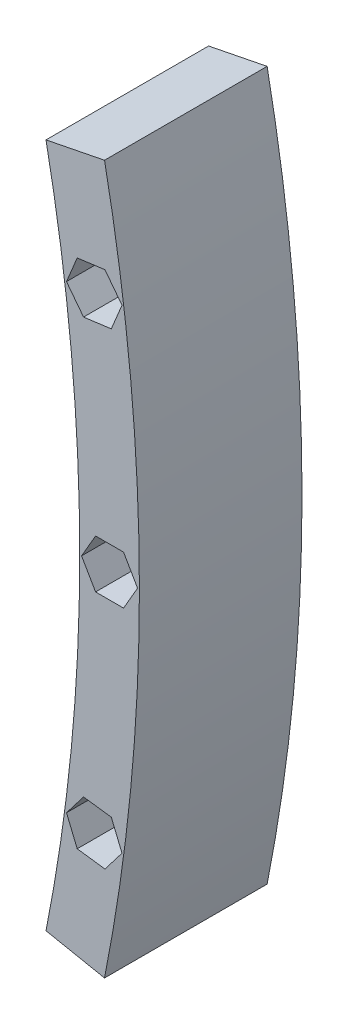
ISO-10303-21;
HEADER;
FILE_DESCRIPTION(('STEP AP214'),'2;1');
FILE_NAME('part.step','',(''),(''),'','','');
FILE_SCHEMA(('AUTOMOTIVE_DESIGN { 1 0 10303 214 1 1 1 1 }'));
ENDSEC;
DATA;
#1=APPLICATION_CONTEXT('core data for automotive mechanical design processes');
#2=APPLICATION_PROTOCOL_DEFINITION('international standard','automotive_design',2000,#1);
#3=PRODUCT_CONTEXT('',#1,'mechanical');
#4=PRODUCT('Part','Part','',(#3));
#5=PRODUCT_RELATED_PRODUCT_CATEGORY('part','',(#4));
#6=PRODUCT_DEFINITION_FORMATION('','',#4);
#7=PRODUCT_DEFINITION_CONTEXT('part definition',#1,'design');
#8=PRODUCT_DEFINITION('design','',#6,#7);
#9=PRODUCT_DEFINITION_SHAPE('','',#8);
#10=(LENGTH_UNIT() NAMED_UNIT(*) SI_UNIT(.MILLI.,.METRE.));
#11=(NAMED_UNIT(*) PLANE_ANGLE_UNIT() SI_UNIT($,.RADIAN.));
#12=(NAMED_UNIT(*) SI_UNIT($,.STERADIAN.) SOLID_ANGLE_UNIT());
#13=UNCERTAINTY_MEASURE_WITH_UNIT(LENGTH_MEASURE(1.E-05),#10,'distance_accuracy_value','');
#14=(GEOMETRIC_REPRESENTATION_CONTEXT(3) GLOBAL_UNCERTAINTY_ASSIGNED_CONTEXT((#13)) GLOBAL_UNIT_ASSIGNED_CONTEXT((#10,
#11,#12)) REPRESENTATION_CONTEXT('',''));
#15=CARTESIAN_POINT('',(0.,0.,0.));
#16=DIRECTION('',(0.,0.,1.));
#17=DIRECTION('',(1.,0.,0.));
#18=AXIS2_PLACEMENT_3D('',#15,#16,#17);
#19=CARTESIAN_POINT('',(0.640728861933532,0.,21.8));
#20=DIRECTION('',(0.,0.,1.));
#21=DIRECTION('',(1.,0.,0.));
#22=AXIS2_PLACEMENT_3D('',#19,#20,#21);
#23=PLANE('',#22);
#24=CARTESIAN_POINT('',(0.640728861933532,0.,21.8));
#25=DIRECTION('',(0.,0.,1.));
#26=DIRECTION('',(1.,0.,0.));
#27=AXIS2_PLACEMENT_3D('',#24,#25,#26);
#28=CIRCLE('',#27,243.359271138079);
#29=CARTESIAN_POINT('',(239.32391984382,-47.4770385719381,21.8));
#30=VERTEX_POINT('',#29);
#31=CARTESIAN_POINT('',(239.32391984382,47.4770385719381,21.8));
#32=VERTEX_POINT('',#31);
#33=EDGE_CURVE('E323',#30,#32,#28,.T.);
#34=ORIENTED_EDGE('',*,*,#33,.T.);
#35=DIRECTION('',(-0.980785280403227,-0.195090322016146,0.));
#36=VECTOR('',#35,1.);
#37=CARTESIAN_POINT('',(239.32391984382,47.4770385719381,21.8));
#38=LINE('',#37,#36);
#39=CARTESIAN_POINT('',(231.477637600594,45.916315995809,21.8));
#40=VERTEX_POINT('',#39);
#41=EDGE_CURVE('E326',#32,#40,#38,.T.);
#42=ORIENTED_EDGE('',*,*,#41,.T.);
#43=CARTESIAN_POINT('',(0.640728861933532,0.,21.8));
#44=DIRECTION('',(0.,0.,-1.));
#45=DIRECTION('',(1.,0.,0.));
#46=AXIS2_PLACEMENT_3D('',#43,#44,#45);
#47=CIRCLE('',#46,235.359271138079);
#48=CARTESIAN_POINT('',(231.477637600594,-45.9163159958091,21.8));
#49=VERTEX_POINT('',#48);
#50=EDGE_CURVE('E329',#40,#49,#47,.T.);
#51=ORIENTED_EDGE('',*,*,#50,.T.);
#52=DIRECTION('',(0.980785280403231,-0.195090322016124,0.));
#53=VECTOR('',#52,1.);
#54=CARTESIAN_POINT('',(239.32391984382,-47.4770385719381,21.8));
#55=LINE('',#54,#53);
#56=EDGE_CURVE('E331',#49,#30,#55,.T.);
#57=ORIENTED_EDGE('',*,*,#56,.T.);
#58=EDGE_LOOP('',(#34,#42,#51,#57));
#59=FACE_BOUND('',#58,.T.);
#60=DIRECTION('',(0.382683432361066,0.923879532512954,0.));
#61=VECTOR('',#60,1.);
#62=CARTESIAN_POINT('',(241.667437954132,31.8161217922106,21.8));
#63=LINE('',#62,#61);
#64=CARTESIAN_POINT('',(240.23131246666,28.3490081630422,21.8));
#65=VERTEX_POINT('',#64);
#66=CARTESIAN_POINT('',(241.667437954132,31.8161217922106,21.8));
#67=VERTEX_POINT('',#66);
#68=EDGE_CURVE('E280',#65,#67,#63,.T.);
#69=ORIENTED_EDGE('',*,*,#68,.F.);
#70=DIRECTION('',(0.991444861373241,0.130526192224373,0.));
#71=VECTOR('',#70,1.);
#72=CARTESIAN_POINT('',(240.23131246666,28.3490081630422,21.8));
#73=LINE('',#72,#71);
#74=CARTESIAN_POINT('',(236.510641242256,27.8591725036314,21.8));
#75=VERTEX_POINT('',#74);
#76=EDGE_CURVE('E278',#75,#65,#73,.T.);
#77=ORIENTED_EDGE('',*,*,#76,.F.);
#78=DIRECTION('',(0.608761429012178,-0.793353340288582,0.));
#79=VECTOR('',#78,1.);
#80=CARTESIAN_POINT('',(236.510641242256,27.8591725036314,21.8));
#81=LINE('',#80,#79);
#82=CARTESIAN_POINT('',(234.226095505325,30.8364504733891,21.8));
#83=VERTEX_POINT('',#82);
#84=EDGE_CURVE('E290',#83,#75,#81,.T.);
#85=ORIENTED_EDGE('',*,*,#84,.F.);
#86=DIRECTION('',(-0.382683432361066,-0.923879532512953,0.));
#87=VECTOR('',#86,1.);
#88=CARTESIAN_POINT('',(234.226095505325,30.8364504733891,21.8));
#89=LINE('',#88,#87);
#90=CARTESIAN_POINT('',(235.662220992798,34.3035641025575,21.8));
#91=VERTEX_POINT('',#90);
#92=EDGE_CURVE('E287',#91,#83,#89,.T.);
#93=ORIENTED_EDGE('',*,*,#92,.F.);
#94=DIRECTION('',(-0.991444861373241,-0.130526192224374,0.));
#95=VECTOR('',#94,1.);
#96=CARTESIAN_POINT('',(235.662220992798,34.3035641025575,21.8));
#97=LINE('',#96,#95);
#98=CARTESIAN_POINT('',(239.382892217201,34.7933997619682,21.8));
#99=VERTEX_POINT('',#98);
#100=EDGE_CURVE('E285',#99,#91,#97,.T.);
#101=ORIENTED_EDGE('',*,*,#100,.F.);
#102=DIRECTION('',(-0.608761429012181,0.79335334028858,0.));
#103=VECTOR('',#102,1.);
#104=CARTESIAN_POINT('',(239.382892217201,34.7933997619682,21.8));
#105=LINE('',#104,#103);
#106=EDGE_CURVE('E283',#67,#99,#105,.T.);
#107=ORIENTED_EDGE('',*,*,#106,.F.);
#108=EDGE_LOOP('',(#69,#77,#85,#93,#101,#107));
#109=FACE_BOUND('',#108,.T.);
#110=DIRECTION('',(0.500000000003788,0.866025403782252,0.));
#111=VECTOR('',#110,1.);
#112=CARTESIAN_POINT('',(241.876388374865,-3.25000000002081,21.8));
#113=LINE('',#112,#111);
#114=CARTESIAN_POINT('',(241.876388374865,-3.25000000002081,21.8));
#115=VERTEX_POINT('',#114);
#116=CARTESIAN_POINT('',(243.752776749745,-2.89693399477583E-11,21.8));
#117=VERTEX_POINT('',#116);
#118=EDGE_CURVE('E235',#115,#117,#113,.T.);
#119=ORIENTED_EDGE('',*,*,#118,.F.);
#120=DIRECTION('',(1.,-4.37104210635652E-12,0.));
#121=VECTOR('',#120,1.);
#122=CARTESIAN_POINT('',(238.123611625132,-3.2500000000044,21.8));
#123=LINE('',#122,#121);
#124=CARTESIAN_POINT('',(238.123611625132,-3.2500000000044,21.8));
#125=VERTEX_POINT('',#124);
#126=EDGE_CURVE('E233',#125,#115,#123,.T.);
#127=ORIENTED_EDGE('',*,*,#126,.F.);
#128=DIRECTION('',(0.499999999996215,-0.866025403786624,0.));
#129=VECTOR('',#128,1.);
#130=CARTESIAN_POINT('',(236.24722325028,3.78337769112423E-12,21.8));
#131=LINE('',#130,#129);
#132=CARTESIAN_POINT('',(236.24722325028,3.78863607153335E-12,21.8));
#133=VERTEX_POINT('',#132);
#134=EDGE_CURVE('E245',#133,#125,#131,.T.);
#135=ORIENTED_EDGE('',*,*,#134,.F.);
#136=DIRECTION('',(-0.500000000003785,-0.866025403782254,0.));
#137=VECTOR('',#136,1.);
#138=CARTESIAN_POINT('',(238.123611625161,3.2499999999956,21.8));
#139=LINE('',#138,#137);
#140=CARTESIAN_POINT('',(238.123611625161,3.2499999999956,21.8));
#141=VERTEX_POINT('',#140);
#142=EDGE_CURVE('E242',#141,#133,#139,.T.);
#143=ORIENTED_EDGE('',*,*,#142,.F.);
#144=DIRECTION('',(-1.,4.37115766901793E-12,0.));
#145=VECTOR('',#144,1.);
#146=CARTESIAN_POINT('',(241.876388374893,3.24999999997919,21.8));
#147=LINE('',#146,#145);
#148=CARTESIAN_POINT('',(241.876388374893,3.24999999997919,21.8));
#149=VERTEX_POINT('',#148);
#150=EDGE_CURVE('E240',#149,#141,#147,.T.);
#151=ORIENTED_EDGE('',*,*,#150,.F.);
#152=DIRECTION('',(-0.499999999996218,0.866025403786622,0.));
#153=VECTOR('',#152,1.);
#154=CARTESIAN_POINT('',(243.752776749745,-2.89693399477583E-11,21.8));
#155=LINE('',#154,#153);
#156=EDGE_CURVE('E238',#117,#149,#155,.T.);
#157=ORIENTED_EDGE('',*,*,#156,.F.);
#158=EDGE_LOOP('',(#119,#127,#135,#143,#151,#157));
#159=FACE_BOUND('',#158,.T.);
#160=DIRECTION('',(0.991444861373241,-0.130526192224374,0.));
#161=VECTOR('',#160,1.);
#162=CARTESIAN_POINT('',(235.662220992798,-34.3035641025575,21.8));
#163=LINE('',#162,#161);
#164=CARTESIAN_POINT('',(235.662220992798,-34.3035641025575,21.8));
#165=VERTEX_POINT('',#164);
#166=CARTESIAN_POINT('',(239.382892217201,-34.7933997619682,21.8));
#167=VERTEX_POINT('',#166);
#168=EDGE_CURVE('E190',#165,#167,#163,.T.);
#169=ORIENTED_EDGE('',*,*,#168,.F.);
#170=DIRECTION('',(0.382683432361066,-0.923879532512953,0.));
#171=VECTOR('',#170,1.);
#172=CARTESIAN_POINT('',(234.226095505325,-30.8364504733891,21.8));
#173=LINE('',#172,#171);
#174=CARTESIAN_POINT('',(234.226095505325,-30.8364504733891,21.8));
#175=VERTEX_POINT('',#174);
#176=EDGE_CURVE('E182',#175,#165,#173,.T.);
#177=ORIENTED_EDGE('',*,*,#176,.F.);
#178=DIRECTION('',(-0.608761429012178,-0.793353340288582,0.));
#179=VECTOR('',#178,1.);
#180=CARTESIAN_POINT('',(236.510641242256,-27.8591725036314,21.8));
#181=LINE('',#180,#179);
#182=CARTESIAN_POINT('',(236.510641242256,-27.8591725036314,21.8));
#183=VERTEX_POINT('',#182);
#184=EDGE_CURVE('E211',#183,#175,#181,.T.);
#185=ORIENTED_EDGE('',*,*,#184,.F.);
#186=DIRECTION('',(-0.991444861373241,0.130526192224373,0.));
#187=VECTOR('',#186,1.);
#188=CARTESIAN_POINT('',(240.23131246666,-28.3490081630422,21.8));
#189=LINE('',#188,#187);
#190=CARTESIAN_POINT('',(240.23131246666,-28.3490081630422,21.8));
#191=VERTEX_POINT('',#190);
#192=EDGE_CURVE('E209',#191,#183,#189,.T.);
#193=ORIENTED_EDGE('',*,*,#192,.F.);
#194=DIRECTION('',(-0.382683432361066,0.923879532512954,0.));
#195=VECTOR('',#194,1.);
#196=CARTESIAN_POINT('',(241.667437954132,-31.8161217922106,21.8));
#197=LINE('',#196,#195);
#198=CARTESIAN_POINT('',(241.667437954132,-31.8161217922106,21.8));
#199=VERTEX_POINT('',#198);
#200=EDGE_CURVE('E205',#199,#191,#197,.T.);
#201=ORIENTED_EDGE('',*,*,#200,.F.);
#202=DIRECTION('',(0.608761429012181,0.79335334028858,0.));
#203=VECTOR('',#202,1.);
#204=CARTESIAN_POINT('',(239.382892217201,-34.7933997619682,21.8));
#205=LINE('',#204,#203);
#206=EDGE_CURVE('E203',#167,#199,#205,.T.);
#207=ORIENTED_EDGE('',*,*,#206,.F.);
#208=EDGE_LOOP('',(#169,#177,#185,#193,#201,#207));
#209=FACE_BOUND('',#208,.T.);
#210=ADVANCED_FACE('F33',(#59,#109,#159,#209),#23,.T.);
#211=CARTESIAN_POINT('',(0.640728861933532,0.,0.));
#212=DIRECTION('',(0.,0.,1.));
#213=DIRECTION('',(1.,0.,0.));
#214=AXIS2_PLACEMENT_3D('',#211,#212,#213);
#215=PLANE('',#214);
#216=DIRECTION('',(1.,-4.37104210635652E-12,0.));
#217=VECTOR('',#216,1.);
#218=CARTESIAN_POINT('',(238.123611625132,-3.2500000000044,0.));
#219=LINE('',#218,#217);
#220=CARTESIAN_POINT('',(238.123611625132,-3.2500000000044,0.));
#221=VERTEX_POINT('',#220);
#222=CARTESIAN_POINT('',(241.876388374865,-3.25000000002081,0.));
#223=VERTEX_POINT('',#222);
#224=EDGE_CURVE('E198',#221,#223,#219,.T.);
#225=ORIENTED_EDGE('',*,*,#224,.T.);
#226=DIRECTION('',(0.500000000003788,0.866025403782252,0.));
#227=VECTOR('',#226,1.);
#228=CARTESIAN_POINT('',(241.876388374865,-3.25000000002081,0.));
#229=LINE('',#228,#227);
#230=CARTESIAN_POINT('',(243.752776749745,-2.89693399477583E-11,0.));
#231=VERTEX_POINT('',#230);
#232=EDGE_CURVE('E250',#223,#231,#229,.T.);
#233=ORIENTED_EDGE('',*,*,#232,.T.);
#234=DIRECTION('',(-0.499999999996218,0.866025403786622,0.));
#235=VECTOR('',#234,1.);
#236=CARTESIAN_POINT('',(243.752776749745,-2.89693399477583E-11,0.));
#237=LINE('',#236,#235);
#238=CARTESIAN_POINT('',(241.876388374893,3.24999999997919,0.));
#239=VERTEX_POINT('',#238);
#240=EDGE_CURVE('E253',#231,#239,#237,.T.);
#241=ORIENTED_EDGE('',*,*,#240,.T.);
#242=DIRECTION('',(-1.,4.37115766901793E-12,0.));
#243=VECTOR('',#242,1.);
#244=CARTESIAN_POINT('',(241.876388374893,3.24999999997919,0.));
#245=LINE('',#244,#243);
#246=CARTESIAN_POINT('',(238.123611625161,3.2499999999956,0.));
#247=VERTEX_POINT('',#246);
#248=EDGE_CURVE('E256',#239,#247,#245,.T.);
#249=ORIENTED_EDGE('',*,*,#248,.T.);
#250=DIRECTION('',(-0.500000000003785,-0.866025403782254,0.));
#251=VECTOR('',#250,1.);
#252=CARTESIAN_POINT('',(238.123611625161,3.2499999999956,0.));
#253=LINE('',#252,#251);
#254=CARTESIAN_POINT('',(236.24722325028,3.78337769112423E-12,0.));
#255=VERTEX_POINT('',#254);
#256=EDGE_CURVE('E259',#247,#255,#253,.T.);
#257=ORIENTED_EDGE('',*,*,#256,.T.);
#258=DIRECTION('',(0.499999999996215,-0.866025403786624,0.));
#259=VECTOR('',#258,1.);
#260=CARTESIAN_POINT('',(236.24722325028,3.78337769112423E-12,0.));
#261=LINE('',#260,#259);
#262=EDGE_CURVE('E236',#255,#221,#261,.T.);
#263=ORIENTED_EDGE('',*,*,#262,.T.);
#264=EDGE_LOOP('',(#225,#233,#241,#249,#257,#263));
#265=FACE_BOUND('',#264,.T.);
#266=CARTESIAN_POINT('',(0.640728861933532,0.,0.));
#267=DIRECTION('',(0.,0.,1.));
#268=DIRECTION('',(1.,0.,0.));
#269=AXIS2_PLACEMENT_3D('',#266,#267,#268);
#270=CIRCLE('',#269,243.359271138079);
#271=CARTESIAN_POINT('',(239.32391984382,-47.4770385719381,0.));
#272=VERTEX_POINT('',#271);
#273=CARTESIAN_POINT('',(239.32391984382,47.4770385719381,0.));
#274=VERTEX_POINT('',#273);
#275=EDGE_CURVE('E322',#272,#274,#270,.T.);
#276=ORIENTED_EDGE('',*,*,#275,.F.);
#277=DIRECTION('',(0.980785280403231,-0.195090322016124,0.));
#278=VECTOR('',#277,1.);
#279=CARTESIAN_POINT('',(239.32391984382,-47.4770385719381,0.));
#280=LINE('',#279,#278);
#281=CARTESIAN_POINT('',(231.477637600594,-45.9163159958091,0.));
#282=VERTEX_POINT('',#281);
#283=EDGE_CURVE('E327',#282,#272,#280,.T.);
#284=ORIENTED_EDGE('',*,*,#283,.F.);
#285=CARTESIAN_POINT('',(0.640728861933532,0.,0.));
#286=DIRECTION('',(0.,0.,-1.));
#287=DIRECTION('',(1.,0.,0.));
#288=AXIS2_PLACEMENT_3D('',#285,#286,#287);
#289=CIRCLE('',#288,235.359271138079);
#290=CARTESIAN_POINT('',(231.477637600594,45.916315995809,0.));
#291=VERTEX_POINT('',#290);
#292=EDGE_CURVE('E338',#291,#282,#289,.T.);
#293=ORIENTED_EDGE('',*,*,#292,.F.);
#294=DIRECTION('',(-0.980785280403227,-0.195090322016146,0.));
#295=VECTOR('',#294,1.);
#296=CARTESIAN_POINT('',(239.32391984382,47.4770385719381,0.));
#297=LINE('',#296,#295);
#298=EDGE_CURVE('E336',#274,#291,#297,.T.);
#299=ORIENTED_EDGE('',*,*,#298,.F.);
#300=EDGE_LOOP('',(#276,#284,#293,#299));
#301=FACE_BOUND('',#300,.T.);
#302=DIRECTION('',(0.991444861373241,0.130526192224373,0.));
#303=VECTOR('',#302,1.);
#304=CARTESIAN_POINT('',(240.23131246666,28.3490081630422,0.));
#305=LINE('',#304,#303);
#306=CARTESIAN_POINT('',(236.510641242256,27.8591725036314,0.));
#307=VERTEX_POINT('',#306);
#308=CARTESIAN_POINT('',(240.23131246666,28.3490081630422,0.));
#309=VERTEX_POINT('',#308);
#310=EDGE_CURVE('E277',#307,#309,#305,.T.);
#311=ORIENTED_EDGE('',*,*,#310,.T.);
#312=DIRECTION('',(0.382683432361066,0.923879532512954,0.));
#313=VECTOR('',#312,1.);
#314=CARTESIAN_POINT('',(241.667437954132,31.8161217922106,0.));
#315=LINE('',#314,#313);
#316=CARTESIAN_POINT('',(241.667437954132,31.8161217922106,0.));
#317=VERTEX_POINT('',#316);
#318=EDGE_CURVE('E295',#309,#317,#315,.T.);
#319=ORIENTED_EDGE('',*,*,#318,.T.);
#320=DIRECTION('',(-0.608761429012181,0.79335334028858,0.));
#321=VECTOR('',#320,1.);
#322=CARTESIAN_POINT('',(239.382892217201,34.7933997619682,0.));
#323=LINE('',#322,#321);
#324=CARTESIAN_POINT('',(239.382892217201,34.7933997619682,0.));
#325=VERTEX_POINT('',#324);
#326=EDGE_CURVE('E298',#317,#325,#323,.T.);
#327=ORIENTED_EDGE('',*,*,#326,.T.);
#328=DIRECTION('',(-0.991444861373241,-0.130526192224374,0.));
#329=VECTOR('',#328,1.);
#330=CARTESIAN_POINT('',(235.662220992798,34.3035641025575,0.));
#331=LINE('',#330,#329);
#332=CARTESIAN_POINT('',(235.662220992798,34.3035641025575,0.));
#333=VERTEX_POINT('',#332);
#334=EDGE_CURVE('E301',#325,#333,#331,.T.);
#335=ORIENTED_EDGE('',*,*,#334,.T.);
#336=DIRECTION('',(-0.382683432361066,-0.923879532512953,0.));
#337=VECTOR('',#336,1.);
#338=CARTESIAN_POINT('',(234.226095505325,30.8364504733891,0.));
#339=LINE('',#338,#337);
#340=CARTESIAN_POINT('',(234.226095505325,30.8364504733891,0.));
#341=VERTEX_POINT('',#340);
#342=EDGE_CURVE('E304',#333,#341,#339,.T.);
#343=ORIENTED_EDGE('',*,*,#342,.T.);
#344=DIRECTION('',(0.608761429012178,-0.793353340288582,0.));
#345=VECTOR('',#344,1.);
#346=CARTESIAN_POINT('',(236.510641242256,27.8591725036314,0.));
#347=LINE('',#346,#345);
#348=EDGE_CURVE('E281',#341,#307,#347,.T.);
#349=ORIENTED_EDGE('',*,*,#348,.T.);
#350=EDGE_LOOP('',(#311,#319,#327,#335,#343,#349));
#351=FACE_BOUND('',#350,.T.);
#352=DIRECTION('',(0.382683432361066,-0.923879532512953,0.));
#353=VECTOR('',#352,1.);
#354=CARTESIAN_POINT('',(234.226095505325,-30.8364504733891,0.));
#355=LINE('',#354,#353);
#356=CARTESIAN_POINT('',(234.226095505325,-30.8364504733891,0.));
#357=VERTEX_POINT('',#356);
#358=CARTESIAN_POINT('',(235.662220992798,-34.3035641025575,0.));
#359=VERTEX_POINT('',#358);
#360=EDGE_CURVE('E56',#357,#359,#355,.T.);
#361=ORIENTED_EDGE('',*,*,#360,.T.);
#362=DIRECTION('',(0.991444861373241,-0.130526192224374,0.));
#363=VECTOR('',#362,1.);
#364=CARTESIAN_POINT('',(235.662220992798,-34.3035641025575,0.));
#365=LINE('',#364,#363);
#366=CARTESIAN_POINT('',(239.382892217201,-34.7933997619682,0.));
#367=VERTEX_POINT('',#366);
#368=EDGE_CURVE('E197',#359,#367,#365,.T.);
#369=ORIENTED_EDGE('',*,*,#368,.T.);
#370=DIRECTION('',(0.608761429012181,0.79335334028858,0.));
#371=VECTOR('',#370,1.);
#372=CARTESIAN_POINT('',(239.382892217201,-34.7933997619682,0.));
#373=LINE('',#372,#371);
#374=CARTESIAN_POINT('',(241.667437954132,-31.8161217922106,0.));
#375=VERTEX_POINT('',#374);
#376=EDGE_CURVE('E215',#367,#375,#373,.T.);
#377=ORIENTED_EDGE('',*,*,#376,.T.);
#378=DIRECTION('',(-0.382683432361066,0.923879532512954,0.));
#379=VECTOR('',#378,1.);
#380=CARTESIAN_POINT('',(241.667437954132,-31.8161217922106,0.));
#381=LINE('',#380,#379);
#382=CARTESIAN_POINT('',(240.23131246666,-28.3490081630422,0.));
#383=VERTEX_POINT('',#382);
#384=EDGE_CURVE('E218',#375,#383,#381,.T.);
#385=ORIENTED_EDGE('',*,*,#384,.T.);
#386=DIRECTION('',(-0.991444861373241,0.130526192224373,0.));
#387=VECTOR('',#386,1.);
#388=CARTESIAN_POINT('',(240.23131246666,-28.3490081630422,0.));
#389=LINE('',#388,#387);
#390=CARTESIAN_POINT('',(236.510641242256,-27.8591725036314,0.));
#391=VERTEX_POINT('',#390);
#392=EDGE_CURVE('E221',#383,#391,#389,.T.);
#393=ORIENTED_EDGE('',*,*,#392,.T.);
#394=DIRECTION('',(-0.608761429012178,-0.793353340288582,0.));
#395=VECTOR('',#394,1.);
#396=CARTESIAN_POINT('',(236.510641242256,-27.8591725036314,0.));
#397=LINE('',#396,#395);
#398=EDGE_CURVE('E191',#391,#357,#397,.T.);
#399=ORIENTED_EDGE('',*,*,#398,.T.);
#400=EDGE_LOOP('',(#361,#369,#377,#385,#393,#399));
#401=FACE_BOUND('',#400,.T.);
#402=ADVANCED_FACE('F356',(#265,#301,#351,#401),#215,.F.);
#403=CARTESIAN_POINT('',(0.640728861933532,0.,21.8));
#404=DIRECTION('',(0.,0.,-1.));
#405=DIRECTION('',(-1.,0.,0.));
#406=AXIS2_PLACEMENT_3D('',#403,#404,#405);
#407=CYLINDRICAL_SURFACE('',#406,243.359271138079);
#408=ORIENTED_EDGE('',*,*,#275,.T.);
#409=DIRECTION('',(0.,0.,-1.));
#410=VECTOR('',#409,1.);
#411=CARTESIAN_POINT('',(239.32391984382,47.4770385719381,21.8));
#412=LINE('',#411,#410);
#413=EDGE_CURVE('E11',#32,#274,#412,.T.);
#414=ORIENTED_EDGE('',*,*,#413,.F.);
#415=ORIENTED_EDGE('',*,*,#33,.F.);
#416=DIRECTION('',(0.,0.,-1.));
#417=VECTOR('',#416,1.);
#418=CARTESIAN_POINT('',(239.32391984382,-47.4770385719381,21.8));
#419=LINE('',#418,#417);
#420=EDGE_CURVE('E333',#30,#272,#419,.T.);
#421=ORIENTED_EDGE('',*,*,#420,.T.);
#422=EDGE_LOOP('',(#408,#414,#415,#421));
#423=FACE_BOUND('',#422,.T.);
#424=ADVANCED_FACE('F35',(#423),#407,.T.);
#425=CARTESIAN_POINT('',(239.32391984382,47.4770385719381,21.8));
#426=DIRECTION('',(0.195090322016146,-0.980785280403227,0.));
#427=DIRECTION('',(0.980785280403227,0.195090322016146,0.));
#428=AXIS2_PLACEMENT_3D('',#425,#426,#427);
#429=PLANE('',#428);
#430=ORIENTED_EDGE('',*,*,#298,.T.);
#431=DIRECTION('',(0.,0.,-1.));
#432=VECTOR('',#431,1.);
#433=CARTESIAN_POINT('',(231.477637600594,45.916315995809,21.8));
#434=LINE('',#433,#432);
#435=EDGE_CURVE('E41',#40,#291,#434,.T.);
#436=ORIENTED_EDGE('',*,*,#435,.F.);
#437=ORIENTED_EDGE('',*,*,#41,.F.);
#438=ORIENTED_EDGE('',*,*,#413,.T.);
#439=EDGE_LOOP('',(#430,#436,#437,#438));
#440=FACE_BOUND('',#439,.T.);
#441=ADVANCED_FACE('F367',(#440),#429,.F.);
#442=CARTESIAN_POINT('',(0.640728861933532,0.,21.8));
#443=DIRECTION('',(0.,0.,-1.));
#444=DIRECTION('',(-1.,0.,0.));
#445=AXIS2_PLACEMENT_3D('',#442,#443,#444);
#446=CYLINDRICAL_SURFACE('',#445,235.359271138079);
#447=ORIENTED_EDGE('',*,*,#292,.T.);
#448=DIRECTION('',(0.,0.,-1.));
#449=VECTOR('',#448,1.);
#450=CARTESIAN_POINT('',(231.477637600594,-45.9163159958091,21.8));
#451=LINE('',#450,#449);
#452=EDGE_CURVE('E343',#49,#282,#451,.T.);
#453=ORIENTED_EDGE('',*,*,#452,.F.);
#454=ORIENTED_EDGE('',*,*,#50,.F.);
#455=ORIENTED_EDGE('',*,*,#435,.T.);
#456=EDGE_LOOP('',(#447,#453,#454,#455));
#457=FACE_BOUND('',#456,.T.);
#458=ADVANCED_FACE('F350',(#457),#446,.F.);
#459=CARTESIAN_POINT('',(239.32391984382,-47.4770385719381,21.8));
#460=DIRECTION('',(0.195090322016124,0.980785280403231,0.));
#461=DIRECTION('',(-0.980785280403231,0.195090322016124,0.));
#462=AXIS2_PLACEMENT_3D('',#459,#460,#461);
#463=PLANE('',#462);
#464=ORIENTED_EDGE('',*,*,#283,.T.);
#465=ORIENTED_EDGE('',*,*,#420,.F.);
#466=ORIENTED_EDGE('',*,*,#56,.F.);
#467=ORIENTED_EDGE('',*,*,#452,.T.);
#468=EDGE_LOOP('',(#464,#465,#466,#467));
#469=FACE_BOUND('',#468,.T.);
#470=ADVANCED_FACE('F360',(#469),#463,.F.);
#471=CARTESIAN_POINT('',(240.23131246666,28.3490081630422,21.8));
#472=DIRECTION('',(-0.130526192224373,0.991444861373242,0.));
#473=DIRECTION('',(-0.991444861373242,-0.130526192224373,0.));
#474=AXIS2_PLACEMENT_3D('',#471,#472,#473);
#475=PLANE('',#474);
#476=ORIENTED_EDGE('',*,*,#310,.F.);
#477=DIRECTION('',(0.,0.,-1.));
#478=VECTOR('',#477,1.);
#479=CARTESIAN_POINT('',(236.510641242256,27.8591725036314,21.8));
#480=LINE('',#479,#478);
#481=EDGE_CURVE('E292',#75,#307,#480,.T.);
#482=ORIENTED_EDGE('',*,*,#481,.F.);
#483=ORIENTED_EDGE('',*,*,#76,.T.);
#484=DIRECTION('',(0.,0.,-1.));
#485=VECTOR('',#484,1.);
#486=CARTESIAN_POINT('',(240.23131246666,28.3490081630422,21.8));
#487=LINE('',#486,#485);
#488=EDGE_CURVE('E319',#65,#309,#487,.T.);
#489=ORIENTED_EDGE('',*,*,#488,.T.);
#490=EDGE_LOOP('',(#476,#482,#483,#489));
#491=FACE_BOUND('',#490,.T.);
#492=ADVANCED_FACE('F382',(#491),#475,.T.);
#493=CARTESIAN_POINT('',(241.667437954132,31.8161217922106,21.8));
#494=DIRECTION('',(-0.923879532512954,0.382683432361066,0.));
#495=DIRECTION('',(-0.382683432361066,-0.923879532512954,0.));
#496=AXIS2_PLACEMENT_3D('',#493,#494,#495);
#497=PLANE('',#496);
#498=ORIENTED_EDGE('',*,*,#318,.F.);
#499=ORIENTED_EDGE('',*,*,#488,.F.);
#500=ORIENTED_EDGE('',*,*,#68,.T.);
#501=DIRECTION('',(0.,0.,-1.));
#502=VECTOR('',#501,1.);
#503=CARTESIAN_POINT('',(241.667437954132,31.8161217922106,21.8));
#504=LINE('',#503,#502);
#505=EDGE_CURVE('E317',#67,#317,#504,.T.);
#506=ORIENTED_EDGE('',*,*,#505,.T.);
#507=EDGE_LOOP('',(#498,#499,#500,#506));
#508=FACE_BOUND('',#507,.T.);
#509=ADVANCED_FACE('F389',(#508),#497,.T.);
#510=CARTESIAN_POINT('',(239.382892217201,34.7933997619682,21.8));
#511=DIRECTION('',(-0.79335334028858,-0.608761429012181,0.));
#512=DIRECTION('',(0.608761429012181,-0.79335334028858,0.));
#513=AXIS2_PLACEMENT_3D('',#510,#511,#512);
#514=PLANE('',#513);
#515=ORIENTED_EDGE('',*,*,#326,.F.);
#516=ORIENTED_EDGE('',*,*,#505,.F.);
#517=ORIENTED_EDGE('',*,*,#106,.T.);
#518=DIRECTION('',(0.,0.,-1.));
#519=VECTOR('',#518,1.);
#520=CARTESIAN_POINT('',(239.382892217201,34.7933997619682,21.8));
#521=LINE('',#520,#519);
#522=EDGE_CURVE('E315',#99,#325,#521,.T.);
#523=ORIENTED_EDGE('',*,*,#522,.T.);
#524=EDGE_LOOP('',(#515,#516,#517,#523));
#525=FACE_BOUND('',#524,.T.);
#526=ADVANCED_FACE('F394',(#525),#514,.T.);
#527=CARTESIAN_POINT('',(235.662220992798,34.3035641025575,21.8));
#528=DIRECTION('',(0.130526192224374,-0.991444861373241,0.));
#529=DIRECTION('',(0.991444861373241,0.130526192224374,0.));
#530=AXIS2_PLACEMENT_3D('',#527,#528,#529);
#531=PLANE('',#530);
#532=ORIENTED_EDGE('',*,*,#334,.F.);
#533=ORIENTED_EDGE('',*,*,#522,.F.);
#534=ORIENTED_EDGE('',*,*,#100,.T.);
#535=DIRECTION('',(0.,0.,-1.));
#536=VECTOR('',#535,1.);
#537=CARTESIAN_POINT('',(235.662220992798,34.3035641025575,21.8));
#538=LINE('',#537,#536);
#539=EDGE_CURVE('E313',#91,#333,#538,.T.);
#540=ORIENTED_EDGE('',*,*,#539,.T.);
#541=EDGE_LOOP('',(#532,#533,#534,#540));
#542=FACE_BOUND('',#541,.T.);
#543=ADVANCED_FACE('F419',(#542),#531,.T.);
#544=CARTESIAN_POINT('',(234.226095505325,30.8364504733891,21.8));
#545=DIRECTION('',(0.923879532512953,-0.382683432361066,0.));
#546=DIRECTION('',(0.382683432361066,0.923879532512953,0.));
#547=AXIS2_PLACEMENT_3D('',#544,#545,#546);
#548=PLANE('',#547);
#549=ORIENTED_EDGE('',*,*,#342,.F.);
#550=ORIENTED_EDGE('',*,*,#539,.F.);
#551=ORIENTED_EDGE('',*,*,#92,.T.);
#552=DIRECTION('',(0.,0.,-1.));
#553=VECTOR('',#552,1.);
#554=CARTESIAN_POINT('',(234.226095505325,30.8364504733891,21.8));
#555=LINE('',#554,#553);
#556=EDGE_CURVE('E311',#83,#341,#555,.T.);
#557=ORIENTED_EDGE('',*,*,#556,.T.);
#558=EDGE_LOOP('',(#549,#550,#551,#557));
#559=FACE_BOUND('',#558,.T.);
#560=ADVANCED_FACE('F408',(#559),#548,.T.);
#561=CARTESIAN_POINT('',(236.510641242256,27.8591725036314,21.8));
#562=DIRECTION('',(0.793353340288582,0.608761429012178,0.));
#563=DIRECTION('',(-0.608761429012178,0.793353340288582,0.));
#564=AXIS2_PLACEMENT_3D('',#561,#562,#563);
#565=PLANE('',#564);
#566=ORIENTED_EDGE('',*,*,#348,.F.);
#567=ORIENTED_EDGE('',*,*,#556,.F.);
#568=ORIENTED_EDGE('',*,*,#84,.T.);
#569=ORIENTED_EDGE('',*,*,#481,.T.);
#570=EDGE_LOOP('',(#566,#567,#568,#569));
#571=FACE_BOUND('',#570,.T.);
#572=ADVANCED_FACE('F401',(#571),#565,.T.);
#573=CARTESIAN_POINT('',(238.123611625132,-3.2500000000044,21.8));
#574=DIRECTION('',(4.37104210635652E-12,1.,0.));
#575=DIRECTION('',(-1.,4.37104210635652E-12,0.));
#576=AXIS2_PLACEMENT_3D('',#573,#574,#575);
#577=PLANE('',#576);
#578=ORIENTED_EDGE('',*,*,#224,.F.);
#579=DIRECTION('',(0.,0.,-1.));
#580=VECTOR('',#579,1.);
#581=CARTESIAN_POINT('',(238.123611625132,-3.2500000000044,21.8));
#582=LINE('',#581,#580);
#583=EDGE_CURVE('E247',#125,#221,#582,.T.);
#584=ORIENTED_EDGE('',*,*,#583,.F.);
#585=ORIENTED_EDGE('',*,*,#126,.T.);
#586=DIRECTION('',(0.,0.,-1.));
#587=VECTOR('',#586,1.);
#588=CARTESIAN_POINT('',(241.876388374865,-3.25000000002081,21.8));
#589=LINE('',#588,#587);
#590=EDGE_CURVE('E274',#115,#223,#589,.T.);
#591=ORIENTED_EDGE('',*,*,#590,.T.);
#592=EDGE_LOOP('',(#578,#584,#585,#591));
#593=FACE_BOUND('',#592,.T.);
#594=ADVANCED_FACE('F431',(#593),#577,.T.);
#595=CARTESIAN_POINT('',(241.876388374865,-3.25000000002081,21.8));
#596=DIRECTION('',(-0.866025403782252,0.500000000003788,0.));
#597=DIRECTION('',(-0.500000000003788,-0.866025403782252,0.));
#598=AXIS2_PLACEMENT_3D('',#595,#596,#597);
#599=PLANE('',#598);
#600=ORIENTED_EDGE('',*,*,#232,.F.);
#601=ORIENTED_EDGE('',*,*,#590,.F.);
#602=ORIENTED_EDGE('',*,*,#118,.T.);
#603=DIRECTION('',(0.,0.,-1.));
#604=VECTOR('',#603,1.);
#605=CARTESIAN_POINT('',(243.752776749745,-2.89693399477583E-11,21.8));
#606=LINE('',#605,#604);
#607=EDGE_CURVE('E272',#117,#231,#606,.T.);
#608=ORIENTED_EDGE('',*,*,#607,.T.);
#609=EDGE_LOOP('',(#600,#601,#602,#608));
#610=FACE_BOUND('',#609,.T.);
#611=ADVANCED_FACE('F434',(#610),#599,.T.);
#612=CARTESIAN_POINT('',(243.752776749745,-2.89693399477583E-11,21.8));
#613=DIRECTION('',(-0.866025403786622,-0.499999999996218,0.));
#614=DIRECTION('',(0.499999999996218,-0.866025403786622,0.));
#615=AXIS2_PLACEMENT_3D('',#612,#613,#614);
#616=PLANE('',#615);
#617=ORIENTED_EDGE('',*,*,#240,.F.);
#618=ORIENTED_EDGE('',*,*,#607,.F.);
#619=ORIENTED_EDGE('',*,*,#156,.T.);
#620=DIRECTION('',(0.,0.,-1.));
#621=VECTOR('',#620,1.);
#622=CARTESIAN_POINT('',(241.876388374893,3.24999999997919,21.8));
#623=LINE('',#622,#621);
#624=EDGE_CURVE('E270',#149,#239,#623,.T.);
#625=ORIENTED_EDGE('',*,*,#624,.T.);
#626=EDGE_LOOP('',(#617,#618,#619,#625));
#627=FACE_BOUND('',#626,.T.);
#628=ADVANCED_FACE('F438',(#627),#616,.T.);
#629=CARTESIAN_POINT('',(241.876388374893,3.24999999997919,21.8));
#630=DIRECTION('',(-4.37115766901793E-12,-1.,0.));
#631=DIRECTION('',(1.,-4.37115766901793E-12,0.));
#632=AXIS2_PLACEMENT_3D('',#629,#630,#631);
#633=PLANE('',#632);
#634=ORIENTED_EDGE('',*,*,#248,.F.);
#635=ORIENTED_EDGE('',*,*,#624,.F.);
#636=ORIENTED_EDGE('',*,*,#150,.T.);
#637=DIRECTION('',(0.,0.,-1.));
#638=VECTOR('',#637,1.);
#639=CARTESIAN_POINT('',(238.123611625161,3.2499999999956,21.8));
#640=LINE('',#639,#638);
#641=EDGE_CURVE('E268',#141,#247,#640,.T.);
#642=ORIENTED_EDGE('',*,*,#641,.T.);
#643=EDGE_LOOP('',(#634,#635,#636,#642));
#644=FACE_BOUND('',#643,.T.);
#645=ADVANCED_FACE('F442',(#644),#633,.T.);
#646=CARTESIAN_POINT('',(238.123611625161,3.2499999999956,21.8));
#647=DIRECTION('',(0.866025403782254,-0.500000000003785,0.));
#648=DIRECTION('',(0.500000000003785,0.866025403782254,0.));
#649=AXIS2_PLACEMENT_3D('',#646,#647,#648);
#650=PLANE('',#649);
#651=ORIENTED_EDGE('',*,*,#256,.F.);
#652=ORIENTED_EDGE('',*,*,#641,.F.);
#653=ORIENTED_EDGE('',*,*,#142,.T.);
#654=DIRECTION('',(0.,0.,-1.));
#655=VECTOR('',#654,1.);
#656=CARTESIAN_POINT('',(236.24722325028,3.78337769112423E-12,21.8));
#657=LINE('',#656,#655);
#658=EDGE_CURVE('E266',#133,#255,#657,.T.);
#659=ORIENTED_EDGE('',*,*,#658,.T.);
#660=EDGE_LOOP('',(#651,#652,#653,#659));
#661=FACE_BOUND('',#660,.T.);
#662=ADVANCED_FACE('F446',(#661),#650,.T.);
#663=CARTESIAN_POINT('',(236.24722325028,3.78337769112423E-12,21.8));
#664=DIRECTION('',(0.866025403786624,0.499999999996215,0.));
#665=DIRECTION('',(-0.499999999996215,0.866025403786624,0.));
#666=AXIS2_PLACEMENT_3D('',#663,#664,#665);
#667=PLANE('',#666);
#668=ORIENTED_EDGE('',*,*,#262,.F.);
#669=ORIENTED_EDGE('',*,*,#658,.F.);
#670=ORIENTED_EDGE('',*,*,#134,.T.);
#671=ORIENTED_EDGE('',*,*,#583,.T.);
#672=EDGE_LOOP('',(#668,#669,#670,#671));
#673=FACE_BOUND('',#672,.T.);
#674=ADVANCED_FACE('F450',(#673),#667,.T.);
#675=CARTESIAN_POINT('',(234.226095505325,-30.8364504733891,21.8));
#676=DIRECTION('',(0.923879532512953,0.382683432361066,0.));
#677=DIRECTION('',(-0.382683432361066,0.923879532512953,0.));
#678=AXIS2_PLACEMENT_3D('',#675,#676,#677);
#679=PLANE('',#678);
#680=ORIENTED_EDGE('',*,*,#360,.F.);
#681=DIRECTION('',(0.,0.,-1.));
#682=VECTOR('',#681,1.);
#683=CARTESIAN_POINT('',(234.226095505325,-30.8364504733891,21.8));
#684=LINE('',#683,#682);
#685=EDGE_CURVE('E186',#175,#357,#684,.T.);
#686=ORIENTED_EDGE('',*,*,#685,.F.);
#687=ORIENTED_EDGE('',*,*,#176,.T.);
#688=DIRECTION('',(0.,0.,-1.));
#689=VECTOR('',#688,1.);
#690=CARTESIAN_POINT('',(235.662220992798,-34.3035641025575,21.8));
#691=LINE('',#690,#689);
#692=EDGE_CURVE('E185',#165,#359,#691,.T.);
#693=ORIENTED_EDGE('',*,*,#692,.T.);
#694=EDGE_LOOP('',(#680,#686,#687,#693));
#695=FACE_BOUND('',#694,.T.);
#696=ADVANCED_FACE('F184',(#695),#679,.T.);
#697=CARTESIAN_POINT('',(235.662220992798,-34.3035641025575,21.8));
#698=DIRECTION('',(0.130526192224374,0.991444861373241,0.));
#699=DIRECTION('',(-0.991444861373241,0.130526192224374,0.));
#700=AXIS2_PLACEMENT_3D('',#697,#698,#699);
#701=PLANE('',#700);
#702=ORIENTED_EDGE('',*,*,#368,.F.);
#703=ORIENTED_EDGE('',*,*,#692,.F.);
#704=ORIENTED_EDGE('',*,*,#168,.T.);
#705=DIRECTION('',(0.,0.,-1.));
#706=VECTOR('',#705,1.);
#707=CARTESIAN_POINT('',(239.382892217201,-34.7933997619682,21.8));
#708=LINE('',#707,#706);
#709=EDGE_CURVE('E199',#167,#367,#708,.T.);
#710=ORIENTED_EDGE('',*,*,#709,.T.);
#711=EDGE_LOOP('',(#702,#703,#704,#710));
#712=FACE_BOUND('',#711,.T.);
#713=ADVANCED_FACE('F194',(#712),#701,.T.);
#714=CARTESIAN_POINT('',(239.382892217201,-34.7933997619682,21.8));
#715=DIRECTION('',(-0.79335334028858,0.608761429012181,0.));
#716=DIRECTION('',(-0.608761429012181,-0.79335334028858,0.));
#717=AXIS2_PLACEMENT_3D('',#714,#715,#716);
#718=PLANE('',#717);
#719=ORIENTED_EDGE('',*,*,#376,.F.);
#720=ORIENTED_EDGE('',*,*,#709,.F.);
#721=ORIENTED_EDGE('',*,*,#206,.T.);
#722=DIRECTION('',(0.,0.,-1.));
#723=VECTOR('',#722,1.);
#724=CARTESIAN_POINT('',(241.667437954132,-31.8161217922106,21.8));
#725=LINE('',#724,#723);
#726=EDGE_CURVE('E230',#199,#375,#725,.T.);
#727=ORIENTED_EDGE('',*,*,#726,.T.);
#728=EDGE_LOOP('',(#719,#720,#721,#727));
#729=FACE_BOUND('',#728,.T.);
#730=ADVANCED_FACE('F459',(#729),#718,.T.);
#731=CARTESIAN_POINT('',(241.667437954132,-31.8161217922106,21.8));
#732=DIRECTION('',(-0.923879532512954,-0.382683432361066,0.));
#733=DIRECTION('',(0.382683432361066,-0.923879532512954,0.));
#734=AXIS2_PLACEMENT_3D('',#731,#732,#733);
#735=PLANE('',#734);
#736=ORIENTED_EDGE('',*,*,#384,.F.);
#737=ORIENTED_EDGE('',*,*,#726,.F.);
#738=ORIENTED_EDGE('',*,*,#200,.T.);
#739=DIRECTION('',(0.,0.,-1.));
#740=VECTOR('',#739,1.);
#741=CARTESIAN_POINT('',(240.23131246666,-28.3490081630422,21.8));
#742=LINE('',#741,#740);
#743=EDGE_CURVE('E228',#191,#383,#742,.T.);
#744=ORIENTED_EDGE('',*,*,#743,.T.);
#745=EDGE_LOOP('',(#736,#737,#738,#744));
#746=FACE_BOUND('',#745,.T.);
#747=ADVANCED_FACE('F462',(#746),#735,.T.);
#748=CARTESIAN_POINT('',(240.23131246666,-28.3490081630422,21.8));
#749=DIRECTION('',(-0.130526192224373,-0.991444861373242,0.));
#750=DIRECTION('',(0.991444861373242,-0.130526192224373,0.));
#751=AXIS2_PLACEMENT_3D('',#748,#749,#750);
#752=PLANE('',#751);
#753=ORIENTED_EDGE('',*,*,#392,.F.);
#754=ORIENTED_EDGE('',*,*,#743,.F.);
#755=ORIENTED_EDGE('',*,*,#192,.T.);
#756=DIRECTION('',(0.,0.,-1.));
#757=VECTOR('',#756,1.);
#758=CARTESIAN_POINT('',(236.510641242256,-27.8591725036314,21.8));
#759=LINE('',#758,#757);
#760=EDGE_CURVE('E48',#183,#391,#759,.T.);
#761=ORIENTED_EDGE('',*,*,#760,.T.);
#762=EDGE_LOOP('',(#753,#754,#755,#761));
#763=FACE_BOUND('',#762,.T.);
#764=ADVANCED_FACE('F466',(#763),#752,.T.);
#765=CARTESIAN_POINT('',(236.510641242256,-27.8591725036314,21.8));
#766=DIRECTION('',(0.793353340288582,-0.608761429012178,0.));
#767=DIRECTION('',(0.608761429012178,0.793353340288582,0.));
#768=AXIS2_PLACEMENT_3D('',#765,#766,#767);
#769=PLANE('',#768);
#770=ORIENTED_EDGE('',*,*,#398,.F.);
#771=ORIENTED_EDGE('',*,*,#760,.F.);
#772=ORIENTED_EDGE('',*,*,#184,.T.);
#773=ORIENTED_EDGE('',*,*,#685,.T.);
#774=EDGE_LOOP('',(#770,#771,#772,#773));
#775=FACE_BOUND('',#774,.T.);
#776=ADVANCED_FACE('F470',(#775),#769,.T.);
#777=CLOSED_SHELL('',(#210,#402,#424,#441,#458,#470,#492,#509,#526,#543,#560,#572,#594,#611,
#628,#645,#662,#674,#696,#713,#730,#747,#764,#776));
#778=MANIFOLD_SOLID_BREP('B2',#777);
#779=ADVANCED_BREP_SHAPE_REPRESENTATION('',(#18,#778),#14);
#780=SHAPE_DEFINITION_REPRESENTATION(#9,#779);
ENDSEC;
END-ISO-10303-21;
